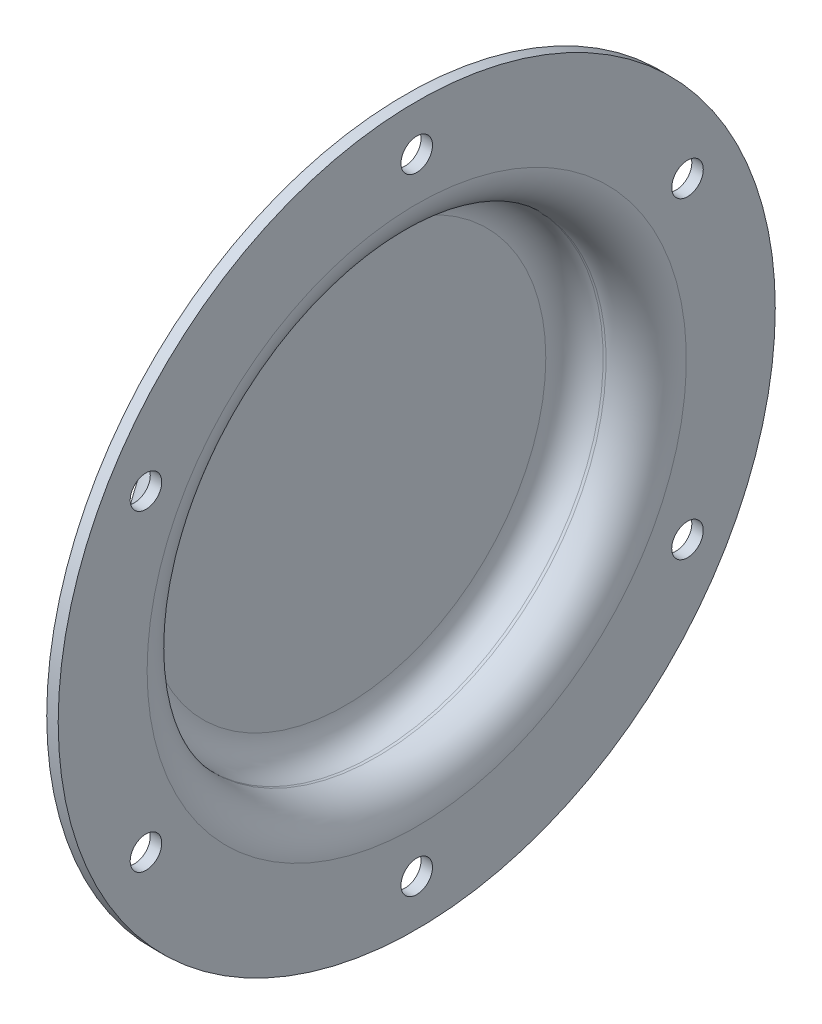
ISO-10303-21;
HEADER;
FILE_DESCRIPTION(('STEP AP214'),'2;1');
FILE_NAME('part.step','',(''),(''),'','','');
FILE_SCHEMA(('AUTOMOTIVE_DESIGN { 1 0 10303 214 1 1 1 1 }'));
ENDSEC;
DATA;
#1=APPLICATION_CONTEXT('core data for automotive mechanical design processes');
#2=APPLICATION_PROTOCOL_DEFINITION('international standard','automotive_design',2000,#1);
#3=PRODUCT_CONTEXT('',#1,'mechanical');
#4=PRODUCT('Part','Part','',(#3));
#5=PRODUCT_RELATED_PRODUCT_CATEGORY('part','',(#4));
#6=PRODUCT_DEFINITION_FORMATION('','',#4);
#7=PRODUCT_DEFINITION_CONTEXT('part definition',#1,'design');
#8=PRODUCT_DEFINITION('design','',#6,#7);
#9=PRODUCT_DEFINITION_SHAPE('','',#8);
#10=(LENGTH_UNIT() NAMED_UNIT(*) SI_UNIT(.MILLI.,.METRE.));
#11=(NAMED_UNIT(*) PLANE_ANGLE_UNIT() SI_UNIT($,.RADIAN.));
#12=(NAMED_UNIT(*) SI_UNIT($,.STERADIAN.) SOLID_ANGLE_UNIT());
#13=UNCERTAINTY_MEASURE_WITH_UNIT(LENGTH_MEASURE(1.E-05),#10,'distance_accuracy_value','');
#14=(GEOMETRIC_REPRESENTATION_CONTEXT(3) GLOBAL_UNCERTAINTY_ASSIGNED_CONTEXT((#13)) GLOBAL_UNIT_ASSIGNED_CONTEXT((#10,
#11,#12)) REPRESENTATION_CONTEXT('',''));
#15=CARTESIAN_POINT('',(0.,0.,0.));
#16=DIRECTION('',(0.,0.,1.));
#17=DIRECTION('',(1.,0.,0.));
#18=AXIS2_PLACEMENT_3D('',#15,#16,#17);
#19=CARTESIAN_POINT('',(-3.99999999999999,69.9999999999999,0.));
#20=DIRECTION('',(1.,0.,0.));
#21=DIRECTION('',(0.,0.,-1.));
#22=AXIS2_PLACEMENT_3D('',#19,#20,#21);
#23=PLANE('',#22);
#24=CARTESIAN_POINT('',(-3.99999999999999,0.,0.));
#25=DIRECTION('',(-1.,0.,0.));
#26=DIRECTION('',(0.,0.,1.));
#27=AXIS2_PLACEMENT_3D('',#24,#25,#26);
#28=CIRCLE('',#27,69.9999999999999);
#29=CARTESIAN_POINT('',(-3.99999999999999,0.,69.9999999999999));
#30=VERTEX_POINT('',#29);
#31=EDGE_CURVE('E10',#30,#30,#28,.T.);
#32=ORIENTED_EDGE('',*,*,#31,.T.);
#33=EDGE_LOOP('',(#32));
#34=FACE_BOUND('',#33,.T.);
#35=ADVANCED_FACE('F33',(#34),#23,.F.);
#36=CARTESIAN_POINT('',(10.,0.,0.));
#37=DIRECTION('',(-1.,0.,0.));
#38=DIRECTION('',(0.,0.,1.));
#39=AXIS2_PLACEMENT_3D('',#36,#37,#38);
#40=TOROIDAL_SURFACE('',#39,70.,14.);
#41=ORIENTED_EDGE('',*,*,#31,.F.);
#42=EDGE_LOOP('',(#41));
#43=FACE_BOUND('',#42,.T.);
#44=CARTESIAN_POINT('',(10.0000000000001,0.,0.));
#45=DIRECTION('',(-1.,0.,0.));
#46=DIRECTION('',(0.,0.,1.));
#47=AXIS2_PLACEMENT_3D('',#44,#45,#46);
#48=CIRCLE('',#47,84.);
#49=CARTESIAN_POINT('',(10.0000000000001,0.,84.));
#50=VERTEX_POINT('',#49);
#51=EDGE_CURVE('E39',#50,#50,#48,.T.);
#52=ORIENTED_EDGE('',*,*,#51,.T.);
#53=EDGE_LOOP('',(#52));
#54=FACE_BOUND('',#53,.T.);
#55=ADVANCED_FACE('F176',(#43,#54),#40,.T.);
#56=CARTESIAN_POINT('',(-4.,0.,0.));
#57=DIRECTION('',(-1.,0.,0.));
#58=DIRECTION('',(0.,0.,1.));
#59=AXIS2_PLACEMENT_3D('',#56,#57,#58);
#60=CYLINDRICAL_SURFACE('',#59,84.);
#61=ORIENTED_EDGE('',*,*,#51,.F.);
#62=EDGE_LOOP('',(#61));
#63=FACE_BOUND('',#62,.T.);
#64=CARTESIAN_POINT('',(11.,0.,0.));
#65=DIRECTION('',(-1.,0.,0.));
#66=DIRECTION('',(0.,0.,1.));
#67=AXIS2_PLACEMENT_3D('',#64,#65,#66);
#68=CIRCLE('',#67,84.);
#69=CARTESIAN_POINT('',(11.,0.,84.));
#70=VERTEX_POINT('',#69);
#71=EDGE_CURVE('E43',#70,#70,#68,.T.);
#72=ORIENTED_EDGE('',*,*,#71,.T.);
#73=EDGE_LOOP('',(#72));
#74=FACE_BOUND('',#73,.T.);
#75=ADVANCED_FACE('F180',(#63,#74),#60,.T.);
#76=CARTESIAN_POINT('',(11.,0.,0.));
#77=DIRECTION('',(-1.,0.,0.));
#78=DIRECTION('',(0.,0.,1.));
#79=AXIS2_PLACEMENT_3D('',#76,#77,#78);
#80=TOROIDAL_SURFACE('',#79,94.,10.);
#81=ORIENTED_EDGE('',*,*,#71,.F.);
#82=EDGE_LOOP('',(#81));
#83=FACE_BOUND('',#82,.T.);
#84=CARTESIAN_POINT('',(21.,0.,0.));
#85=DIRECTION('',(-1.,0.,0.));
#86=DIRECTION('',(0.,0.,1.));
#87=AXIS2_PLACEMENT_3D('',#84,#85,#86);
#88=CIRCLE('',#87,94.0000000000001);
#89=CARTESIAN_POINT('',(21.,0.,94.0000000000001));
#90=VERTEX_POINT('',#89);
#91=EDGE_CURVE('E47',#90,#90,#88,.T.);
#92=ORIENTED_EDGE('',*,*,#91,.T.);
#93=EDGE_LOOP('',(#92));
#94=FACE_BOUND('',#93,.T.);
#95=ADVANCED_FACE('F121',(#83,#94),#80,.F.);
#96=CARTESIAN_POINT('',(21.,125.,0.));
#97=DIRECTION('',(1.,0.,0.));
#98=DIRECTION('',(0.,0.,-1.));
#99=AXIS2_PLACEMENT_3D('',#96,#97,#98);
#100=PLANE('',#99);
#101=CARTESIAN_POINT('',(21.,54.5000000000011,94.3967690125032));
#102=DIRECTION('',(-1.,0.,0.));
#103=DIRECTION('',(0.,-0.866025403784433,0.50000000000001));
#104=AXIS2_PLACEMENT_3D('',#101,#102,#103);
#105=CIRCLE('',#104,5.5);
#106=CARTESIAN_POINT('',(21.,49.7368602791867,97.1467690125032));
#107=VERTEX_POINT('',#106);
#108=EDGE_CURVE('E101',#107,#107,#105,.T.);
#109=ORIENTED_EDGE('',*,*,#108,.F.);
#110=EDGE_LOOP('',(#109));
#111=FACE_BOUND('',#110,.T.);
#112=CARTESIAN_POINT('',(21.,-54.4999999999991,94.3967690125043));
#113=DIRECTION('',(-1.,0.,0.));
#114=DIRECTION('',(0.,-0.866025403784443,-0.499999999999992));
#115=AXIS2_PLACEMENT_3D('',#112,#113,#114);
#116=CIRCLE('',#115,5.5);
#117=CARTESIAN_POINT('',(21.,-59.2631397208136,91.6467690125044));
#118=VERTEX_POINT('',#117);
#119=EDGE_CURVE('E95',#118,#118,#116,.T.);
#120=ORIENTED_EDGE('',*,*,#119,.F.);
#121=EDGE_LOOP('',(#120));
#122=FACE_BOUND('',#121,.T.);
#123=CARTESIAN_POINT('',(21.,-109.,0.));
#124=DIRECTION('',(-1.,0.,0.));
#125=DIRECTION('',(0.,0.,-1.));
#126=AXIS2_PLACEMENT_3D('',#123,#124,#125);
#127=CIRCLE('',#126,5.5);
#128=CARTESIAN_POINT('',(21.,-109.,-5.5));
#129=VERTEX_POINT('',#128);
#130=EDGE_CURVE('E89',#129,#129,#127,.T.);
#131=ORIENTED_EDGE('',*,*,#130,.F.);
#132=EDGE_LOOP('',(#131));
#133=FACE_BOUND('',#132,.T.);
#134=CARTESIAN_POINT('',(21.,-54.5000000000004,-94.3967690125036));
#135=DIRECTION('',(-1.,0.,0.));
#136=DIRECTION('',(0.,0.866025403784436,-0.500000000000004));
#137=AXIS2_PLACEMENT_3D('',#134,#135,#136);
#138=CIRCLE('',#137,5.5);
#139=CARTESIAN_POINT('',(21.,-49.736860279186,-97.1467690125036));
#140=VERTEX_POINT('',#139);
#141=EDGE_CURVE('E83',#140,#140,#138,.T.);
#142=ORIENTED_EDGE('',*,*,#141,.F.);
#143=EDGE_LOOP('',(#142));
#144=FACE_BOUND('',#143,.T.);
#145=CARTESIAN_POINT('',(21.,54.4999999999998,-94.3967690125039));
#146=DIRECTION('',(-1.,0.,0.));
#147=DIRECTION('',(0.,0.86602540378444,0.499999999999998));
#148=AXIS2_PLACEMENT_3D('',#145,#146,#147);
#149=CIRCLE('',#148,5.5);
#150=CARTESIAN_POINT('',(21.,59.2631397208142,-91.6467690125039));
#151=VERTEX_POINT('',#150);
#152=EDGE_CURVE('E77',#151,#151,#149,.T.);
#153=ORIENTED_EDGE('',*,*,#152,.F.);
#154=EDGE_LOOP('',(#153));
#155=FACE_BOUND('',#154,.T.);
#156=CARTESIAN_POINT('',(21.,109.,0.));
#157=DIRECTION('',(-1.,0.,0.));
#158=DIRECTION('',(0.,0.,1.));
#159=AXIS2_PLACEMENT_3D('',#156,#157,#158);
#160=CIRCLE('',#159,5.5);
#161=CARTESIAN_POINT('',(21.,109.,5.5));
#162=VERTEX_POINT('',#161);
#163=EDGE_CURVE('E71',#162,#162,#160,.T.);
#164=ORIENTED_EDGE('',*,*,#163,.F.);
#165=EDGE_LOOP('',(#164));
#166=FACE_BOUND('',#165,.T.);
#167=ORIENTED_EDGE('',*,*,#91,.F.);
#168=EDGE_LOOP('',(#167));
#169=FACE_BOUND('',#168,.T.);
#170=CARTESIAN_POINT('',(21.,0.,0.));
#171=DIRECTION('',(-1.,0.,0.));
#172=DIRECTION('',(0.,0.,1.));
#173=AXIS2_PLACEMENT_3D('',#170,#171,#172);
#174=CIRCLE('',#173,125.);
#175=CARTESIAN_POINT('',(21.,0.,125.));
#176=VERTEX_POINT('',#175);
#177=EDGE_CURVE('E52',#176,#176,#174,.T.);
#178=ORIENTED_EDGE('',*,*,#177,.T.);
#179=EDGE_LOOP('',(#178));
#180=FACE_BOUND('',#179,.T.);
#181=ADVANCED_FACE('F117',(#111,#122,#133,#144,#155,#166,#169,#180),#100,.F.);
#182=CARTESIAN_POINT('',(-4.,0.,0.));
#183=DIRECTION('',(-1.,0.,0.));
#184=DIRECTION('',(0.,0.,1.));
#185=AXIS2_PLACEMENT_3D('',#182,#183,#184);
#186=CYLINDRICAL_SURFACE('',#185,125.);
#187=ORIENTED_EDGE('',*,*,#177,.F.);
#188=EDGE_LOOP('',(#187));
#189=FACE_BOUND('',#188,.T.);
#190=CARTESIAN_POINT('',(25.,0.,0.));
#191=DIRECTION('',(-1.,0.,0.));
#192=DIRECTION('',(0.,0.,1.));
#193=AXIS2_PLACEMENT_3D('',#190,#191,#192);
#194=CIRCLE('',#193,125.);
#195=CARTESIAN_POINT('',(25.,0.,125.));
#196=VERTEX_POINT('',#195);
#197=EDGE_CURVE('E55',#196,#196,#194,.T.);
#198=ORIENTED_EDGE('',*,*,#197,.T.);
#199=EDGE_LOOP('',(#198));
#200=FACE_BOUND('',#199,.T.);
#201=ADVANCED_FACE('F120',(#189,#200),#186,.T.);
#202=CARTESIAN_POINT('',(25.,94.0000000000001,0.));
#203=DIRECTION('',(-1.,0.,0.));
#204=DIRECTION('',(0.,0.,1.));
#205=AXIS2_PLACEMENT_3D('',#202,#203,#204);
#206=PLANE('',#205);
#207=CARTESIAN_POINT('',(25.,54.5000000000011,94.3967690125032));
#208=DIRECTION('',(-1.,0.,0.));
#209=DIRECTION('',(0.,-0.866025403784433,0.50000000000001));
#210=AXIS2_PLACEMENT_3D('',#207,#208,#209);
#211=CIRCLE('',#210,5.5);
#212=CARTESIAN_POINT('',(25.,49.7368602791867,97.1467690125032));
#213=VERTEX_POINT('',#212);
#214=EDGE_CURVE('E98',#213,#213,#211,.T.);
#215=ORIENTED_EDGE('',*,*,#214,.T.);
#216=EDGE_LOOP('',(#215));
#217=FACE_BOUND('',#216,.T.);
#218=CARTESIAN_POINT('',(25.,-54.4999999999991,94.3967690125043));
#219=DIRECTION('',(-1.,0.,0.));
#220=DIRECTION('',(0.,-0.866025403784443,-0.499999999999992));
#221=AXIS2_PLACEMENT_3D('',#218,#219,#220);
#222=CIRCLE('',#221,5.5);
#223=CARTESIAN_POINT('',(25.,-59.2631397208136,91.6467690125044));
#224=VERTEX_POINT('',#223);
#225=EDGE_CURVE('E92',#224,#224,#222,.T.);
#226=ORIENTED_EDGE('',*,*,#225,.T.);
#227=EDGE_LOOP('',(#226));
#228=FACE_BOUND('',#227,.T.);
#229=CARTESIAN_POINT('',(25.,-109.,0.));
#230=DIRECTION('',(-1.,0.,0.));
#231=DIRECTION('',(0.,0.,-1.));
#232=AXIS2_PLACEMENT_3D('',#229,#230,#231);
#233=CIRCLE('',#232,5.5);
#234=CARTESIAN_POINT('',(25.,-109.,-5.5));
#235=VERTEX_POINT('',#234);
#236=EDGE_CURVE('E86',#235,#235,#233,.T.);
#237=ORIENTED_EDGE('',*,*,#236,.T.);
#238=EDGE_LOOP('',(#237));
#239=FACE_BOUND('',#238,.T.);
#240=CARTESIAN_POINT('',(25.,-54.5000000000004,-94.3967690125036));
#241=DIRECTION('',(-1.,0.,0.));
#242=DIRECTION('',(0.,0.866025403784436,-0.500000000000004));
#243=AXIS2_PLACEMENT_3D('',#240,#241,#242);
#244=CIRCLE('',#243,5.5);
#245=CARTESIAN_POINT('',(25.,-49.736860279186,-97.1467690125036));
#246=VERTEX_POINT('',#245);
#247=EDGE_CURVE('E80',#246,#246,#244,.T.);
#248=ORIENTED_EDGE('',*,*,#247,.T.);
#249=EDGE_LOOP('',(#248));
#250=FACE_BOUND('',#249,.T.);
#251=CARTESIAN_POINT('',(25.,54.4999999999998,-94.3967690125039));
#252=DIRECTION('',(-1.,0.,0.));
#253=DIRECTION('',(0.,0.86602540378444,0.499999999999998));
#254=AXIS2_PLACEMENT_3D('',#251,#252,#253);
#255=CIRCLE('',#254,5.5);
#256=CARTESIAN_POINT('',(25.,59.2631397208142,-91.6467690125039));
#257=VERTEX_POINT('',#256);
#258=EDGE_CURVE('E74',#257,#257,#255,.T.);
#259=ORIENTED_EDGE('',*,*,#258,.T.);
#260=EDGE_LOOP('',(#259));
#261=FACE_BOUND('',#260,.T.);
#262=CARTESIAN_POINT('',(25.,109.,0.));
#263=DIRECTION('',(-1.,0.,0.));
#264=DIRECTION('',(0.,0.,1.));
#265=AXIS2_PLACEMENT_3D('',#262,#263,#264);
#266=CIRCLE('',#265,5.5);
#267=CARTESIAN_POINT('',(25.,109.,5.5));
#268=VERTEX_POINT('',#267);
#269=EDGE_CURVE('E70',#268,#268,#266,.T.);
#270=ORIENTED_EDGE('',*,*,#269,.T.);
#271=EDGE_LOOP('',(#270));
#272=FACE_BOUND('',#271,.T.);
#273=ORIENTED_EDGE('',*,*,#197,.F.);
#274=EDGE_LOOP('',(#273));
#275=FACE_BOUND('',#274,.T.);
#276=CARTESIAN_POINT('',(25.,0.,0.));
#277=DIRECTION('',(-1.,0.,0.));
#278=DIRECTION('',(0.,0.,1.));
#279=AXIS2_PLACEMENT_3D('',#276,#277,#278);
#280=CIRCLE('',#279,94.0000000000001);
#281=CARTESIAN_POINT('',(25.,0.,94.0000000000001));
#282=VERTEX_POINT('',#281);
#283=EDGE_CURVE('E58',#282,#282,#280,.T.);
#284=ORIENTED_EDGE('',*,*,#283,.T.);
#285=EDGE_LOOP('',(#284));
#286=FACE_BOUND('',#285,.T.);
#287=ADVANCED_FACE('F107',(#217,#228,#239,#250,#261,#272,#275,#286),#206,.F.);
#288=CARTESIAN_POINT('',(11.,0.,0.));
#289=DIRECTION('',(-1.,0.,0.));
#290=DIRECTION('',(0.,0.,1.));
#291=AXIS2_PLACEMENT_3D('',#288,#289,#290);
#292=TOROIDAL_SURFACE('',#291,94.,14.);
#293=ORIENTED_EDGE('',*,*,#283,.F.);
#294=EDGE_LOOP('',(#293));
#295=FACE_BOUND('',#294,.T.);
#296=CARTESIAN_POINT('',(10.9999999999999,0.,0.));
#297=DIRECTION('',(-1.,0.,0.));
#298=DIRECTION('',(0.,0.,1.));
#299=AXIS2_PLACEMENT_3D('',#296,#297,#298);
#300=CIRCLE('',#299,80.);
#301=CARTESIAN_POINT('',(10.9999999999999,0.,80.));
#302=VERTEX_POINT('',#301);
#303=EDGE_CURVE('E61',#302,#302,#300,.T.);
#304=ORIENTED_EDGE('',*,*,#303,.T.);
#305=EDGE_LOOP('',(#304));
#306=FACE_BOUND('',#305,.T.);
#307=ADVANCED_FACE('F144',(#295,#306),#292,.T.);
#308=CARTESIAN_POINT('',(-4.,0.,0.));
#309=DIRECTION('',(-1.,0.,0.));
#310=DIRECTION('',(0.,0.,1.));
#311=AXIS2_PLACEMENT_3D('',#308,#309,#310);
#312=CYLINDRICAL_SURFACE('',#311,80.);
#313=ORIENTED_EDGE('',*,*,#303,.F.);
#314=EDGE_LOOP('',(#313));
#315=FACE_BOUND('',#314,.T.);
#316=CARTESIAN_POINT('',(10.0000000000001,0.,0.));
#317=DIRECTION('',(-1.,0.,0.));
#318=DIRECTION('',(0.,0.,1.));
#319=AXIS2_PLACEMENT_3D('',#316,#317,#318);
#320=CIRCLE('',#319,80.);
#321=CARTESIAN_POINT('',(10.0000000000001,0.,80.));
#322=VERTEX_POINT('',#321);
#323=EDGE_CURVE('E64',#322,#322,#320,.T.);
#324=ORIENTED_EDGE('',*,*,#323,.T.);
#325=EDGE_LOOP('',(#324));
#326=FACE_BOUND('',#325,.T.);
#327=ADVANCED_FACE('F150',(#315,#326),#312,.F.);
#328=CARTESIAN_POINT('',(10.,0.,0.));
#329=DIRECTION('',(-1.,0.,0.));
#330=DIRECTION('',(0.,0.,1.));
#331=AXIS2_PLACEMENT_3D('',#328,#329,#330);
#332=TOROIDAL_SURFACE('',#331,70.,10.);
#333=ORIENTED_EDGE('',*,*,#323,.F.);
#334=EDGE_LOOP('',(#333));
#335=FACE_BOUND('',#334,.T.);
#336=CARTESIAN_POINT('',(0.,0.,0.));
#337=DIRECTION('',(-1.,0.,0.));
#338=DIRECTION('',(0.,0.,1.));
#339=AXIS2_PLACEMENT_3D('',#336,#337,#338);
#340=CIRCLE('',#339,69.9999999999999);
#341=CARTESIAN_POINT('',(0.,0.,69.9999999999999));
#342=VERTEX_POINT('',#341);
#343=EDGE_CURVE('E67',#342,#342,#340,.T.);
#344=ORIENTED_EDGE('',*,*,#343,.T.);
#345=EDGE_LOOP('',(#344));
#346=FACE_BOUND('',#345,.T.);
#347=ADVANCED_FACE('F156',(#335,#346),#332,.F.);
#348=CARTESIAN_POINT('',(0.,0.,0.));
#349=DIRECTION('',(-1.,0.,0.));
#350=DIRECTION('',(0.,0.,1.));
#351=AXIS2_PLACEMENT_3D('',#348,#349,#350);
#352=PLANE('',#351);
#353=ORIENTED_EDGE('',*,*,#343,.F.);
#354=EDGE_LOOP('',(#353));
#355=FACE_BOUND('',#354,.T.);
#356=ADVANCED_FACE('F162',(#355),#352,.F.);
#357=CARTESIAN_POINT('',(25.,109.,0.));
#358=DIRECTION('',(-1.,0.,0.));
#359=DIRECTION('',(0.,0.,1.));
#360=AXIS2_PLACEMENT_3D('',#357,#358,#359);
#361=CYLINDRICAL_SURFACE('',#360,5.5);
#362=ORIENTED_EDGE('',*,*,#269,.F.);
#363=EDGE_LOOP('',(#362));
#364=FACE_BOUND('',#363,.T.);
#365=ORIENTED_EDGE('',*,*,#163,.T.);
#366=EDGE_LOOP('',(#365));
#367=FACE_BOUND('',#366,.T.);
#368=ADVANCED_FACE('F167',(#364,#367),#361,.F.);
#369=CARTESIAN_POINT('',(25.,54.4999999999998,-94.3967690125039));
#370=DIRECTION('',(-1.,0.,0.));
#371=DIRECTION('',(0.,0.,1.));
#372=AXIS2_PLACEMENT_3D('',#369,#370,#371);
#373=CYLINDRICAL_SURFACE('',#372,5.5);
#374=ORIENTED_EDGE('',*,*,#258,.F.);
#375=EDGE_LOOP('',(#374));
#376=FACE_BOUND('',#375,.T.);
#377=ORIENTED_EDGE('',*,*,#152,.T.);
#378=EDGE_LOOP('',(#377));
#379=FACE_BOUND('',#378,.T.);
#380=ADVANCED_FACE('F172',(#376,#379),#373,.F.);
#381=CARTESIAN_POINT('',(25.,-54.5000000000004,-94.3967690125036));
#382=DIRECTION('',(-1.,0.,0.));
#383=DIRECTION('',(0.,0.,1.));
#384=AXIS2_PLACEMENT_3D('',#381,#382,#383);
#385=CYLINDRICAL_SURFACE('',#384,5.5);
#386=ORIENTED_EDGE('',*,*,#247,.F.);
#387=EDGE_LOOP('',(#386));
#388=FACE_BOUND('',#387,.T.);
#389=ORIENTED_EDGE('',*,*,#141,.T.);
#390=EDGE_LOOP('',(#389));
#391=FACE_BOUND('',#390,.T.);
#392=ADVANCED_FACE('F240',(#388,#391),#385,.F.);
#393=CARTESIAN_POINT('',(25.,-109.,0.));
#394=DIRECTION('',(-1.,0.,0.));
#395=DIRECTION('',(0.,0.,1.));
#396=AXIS2_PLACEMENT_3D('',#393,#394,#395);
#397=CYLINDRICAL_SURFACE('',#396,5.5);
#398=ORIENTED_EDGE('',*,*,#236,.F.);
#399=EDGE_LOOP('',(#398));
#400=FACE_BOUND('',#399,.T.);
#401=ORIENTED_EDGE('',*,*,#130,.T.);
#402=EDGE_LOOP('',(#401));
#403=FACE_BOUND('',#402,.T.);
#404=ADVANCED_FACE('F247',(#400,#403),#397,.F.);
#405=CARTESIAN_POINT('',(25.,-54.4999999999991,94.3967690125043));
#406=DIRECTION('',(-1.,0.,0.));
#407=DIRECTION('',(0.,0.,1.));
#408=AXIS2_PLACEMENT_3D('',#405,#406,#407);
#409=CYLINDRICAL_SURFACE('',#408,5.5);
#410=ORIENTED_EDGE('',*,*,#225,.F.);
#411=EDGE_LOOP('',(#410));
#412=FACE_BOUND('',#411,.T.);
#413=ORIENTED_EDGE('',*,*,#119,.T.);
#414=EDGE_LOOP('',(#413));
#415=FACE_BOUND('',#414,.T.);
#416=ADVANCED_FACE('F113',(#412,#415),#409,.F.);
#417=CARTESIAN_POINT('',(25.,54.5000000000011,94.3967690125032));
#418=DIRECTION('',(-1.,0.,0.));
#419=DIRECTION('',(0.,0.,1.));
#420=AXIS2_PLACEMENT_3D('',#417,#418,#419);
#421=CYLINDRICAL_SURFACE('',#420,5.5);
#422=ORIENTED_EDGE('',*,*,#214,.F.);
#423=EDGE_LOOP('',(#422));
#424=FACE_BOUND('',#423,.T.);
#425=ORIENTED_EDGE('',*,*,#108,.T.);
#426=EDGE_LOOP('',(#425));
#427=FACE_BOUND('',#426,.T.);
#428=ADVANCED_FACE('F110',(#424,#427),#421,.F.);
#429=CLOSED_SHELL('',(#35,#55,#75,#95,#181,#201,#287,#307,#327,#347,#356,#368,#380,#392,#404,
#416,#428));
#430=MANIFOLD_SOLID_BREP('B2',#429);
#431=ADVANCED_BREP_SHAPE_REPRESENTATION('',(#18,#430),#14);
#432=SHAPE_DEFINITION_REPRESENTATION(#9,#431);
ENDSEC;
END-ISO-10303-21;
